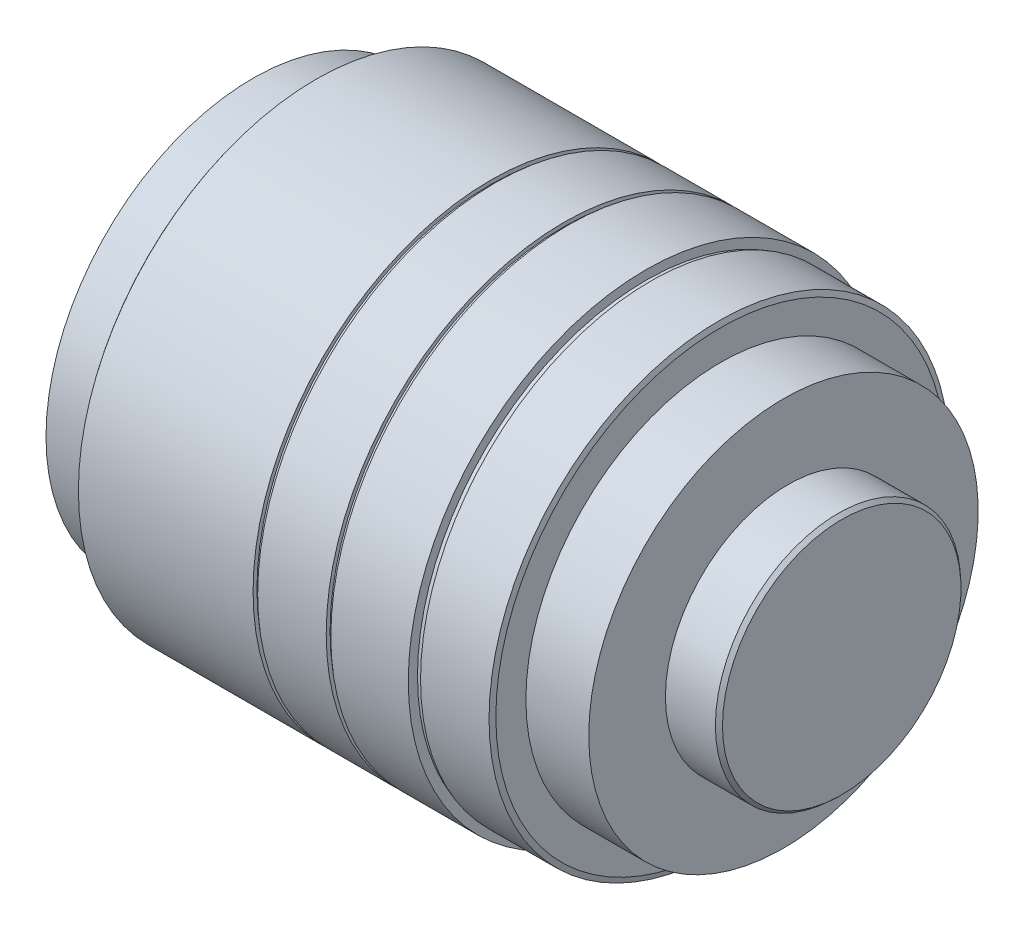
ISO-10303-21;
HEADER;
FILE_DESCRIPTION(('STEP AP214'),'2;1');
FILE_NAME('part.step','',(''),(''),'','','');
FILE_SCHEMA(('AUTOMOTIVE_DESIGN { 1 0 10303 214 1 1 1 1 }'));
ENDSEC;
DATA;
#1=APPLICATION_CONTEXT('core data for automotive mechanical design processes');
#2=APPLICATION_PROTOCOL_DEFINITION('international standard','automotive_design',2000,#1);
#3=PRODUCT_CONTEXT('',#1,'mechanical');
#4=PRODUCT('Part','Part','',(#3));
#5=PRODUCT_RELATED_PRODUCT_CATEGORY('part','',(#4));
#6=PRODUCT_DEFINITION_FORMATION('','',#4);
#7=PRODUCT_DEFINITION_CONTEXT('part definition',#1,'design');
#8=PRODUCT_DEFINITION('design','',#6,#7);
#9=PRODUCT_DEFINITION_SHAPE('','',#8);
#10=(LENGTH_UNIT() NAMED_UNIT(*) SI_UNIT(.MILLI.,.METRE.));
#11=(NAMED_UNIT(*) PLANE_ANGLE_UNIT() SI_UNIT($,.RADIAN.));
#12=(NAMED_UNIT(*) SI_UNIT($,.STERADIAN.) SOLID_ANGLE_UNIT());
#13=UNCERTAINTY_MEASURE_WITH_UNIT(LENGTH_MEASURE(1.E-05),#10,'distance_accuracy_value','');
#14=(GEOMETRIC_REPRESENTATION_CONTEXT(3) GLOBAL_UNCERTAINTY_ASSIGNED_CONTEXT((#13)) GLOBAL_UNIT_ASSIGNED_CONTEXT((#10,
#11,#12)) REPRESENTATION_CONTEXT('',''));
#15=CARTESIAN_POINT('',(0.,0.,0.));
#16=DIRECTION('',(0.,0.,1.));
#17=DIRECTION('',(1.,0.,0.));
#18=AXIS2_PLACEMENT_3D('',#15,#16,#17);
#19=CARTESIAN_POINT('',(-38.4,0.,0.));
#20=DIRECTION('',(1.,0.,0.));
#21=DIRECTION('',(0.,0.,-1.));
#22=AXIS2_PLACEMENT_3D('',#19,#20,#21);
#23=PLANE('',#22);
#24=CARTESIAN_POINT('',(-38.4,0.,0.));
#25=DIRECTION('',(-1.,0.,0.));
#26=DIRECTION('',(0.,0.,1.));
#27=AXIS2_PLACEMENT_3D('',#24,#25,#26);
#28=CIRCLE('',#27,9.11286089238845);
#29=CARTESIAN_POINT('',(-38.4,0.,9.11286089238845));
#30=VERTEX_POINT('',#29);
#31=EDGE_CURVE('E71',#30,#30,#28,.T.);
#32=ORIENTED_EDGE('',*,*,#31,.F.);
#33=EDGE_LOOP('',(#32));
#34=FACE_BOUND('',#33,.T.);
#35=CARTESIAN_POINT('',(-38.4,0.,0.));
#36=DIRECTION('',(-1.,0.,0.));
#37=DIRECTION('',(0.,0.,1.));
#38=AXIS2_PLACEMENT_3D('',#35,#36,#37);
#39=CIRCLE('',#38,13.5);
#40=CARTESIAN_POINT('',(-38.4,0.,13.5));
#41=VERTEX_POINT('',#40);
#42=EDGE_CURVE('E11',#41,#41,#39,.T.);
#43=ORIENTED_EDGE('',*,*,#42,.T.);
#44=EDGE_LOOP('',(#43));
#45=FACE_BOUND('',#44,.T.);
#46=ADVANCED_FACE('F40',(#34,#45),#23,.F.);
#47=CARTESIAN_POINT('',(-61.5958718073628,0.,0.));
#48=DIRECTION('',(-1.,0.,0.));
#49=DIRECTION('',(0.,0.,1.));
#50=AXIS2_PLACEMENT_3D('',#47,#48,#49);
#51=CYLINDRICAL_SURFACE('',#50,13.5);
#52=ORIENTED_EDGE('',*,*,#42,.F.);
#53=EDGE_LOOP('',(#52));
#54=FACE_BOUND('',#53,.T.);
#55=CARTESIAN_POINT('',(-34.4,0.,0.));
#56=DIRECTION('',(-1.,0.,0.));
#57=DIRECTION('',(0.,0.,1.));
#58=AXIS2_PLACEMENT_3D('',#55,#56,#57);
#59=CIRCLE('',#58,13.5);
#60=CARTESIAN_POINT('',(-34.4,0.,13.5));
#61=VERTEX_POINT('',#60);
#62=EDGE_CURVE('E46',#61,#61,#59,.T.);
#63=ORIENTED_EDGE('',*,*,#62,.T.);
#64=EDGE_LOOP('',(#63));
#65=FACE_BOUND('',#64,.T.);
#66=ADVANCED_FACE('F62',(#54,#65),#51,.T.);
#67=CARTESIAN_POINT('',(-34.4,13.5,0.));
#68=DIRECTION('',(1.,0.,0.));
#69=DIRECTION('',(0.,0.,-1.));
#70=AXIS2_PLACEMENT_3D('',#67,#68,#69);
#71=PLANE('',#70);
#72=ORIENTED_EDGE('',*,*,#62,.F.);
#73=EDGE_LOOP('',(#72));
#74=FACE_BOUND('',#73,.T.);
#75=CARTESIAN_POINT('',(-34.4,0.,0.));
#76=DIRECTION('',(-1.,0.,0.));
#77=DIRECTION('',(0.,0.,1.));
#78=AXIS2_PLACEMENT_3D('',#75,#76,#77);
#79=CIRCLE('',#78,15.3545919618712);
#80=CARTESIAN_POINT('',(-34.4,0.,15.3545919618712));
#81=VERTEX_POINT('',#80);
#82=EDGE_CURVE('E77',#81,#81,#79,.T.);
#83=ORIENTED_EDGE('',*,*,#82,.T.);
#84=EDGE_LOOP('',(#83));
#85=FACE_BOUND('',#84,.T.);
#86=ADVANCED_FACE('F67',(#74,#85),#71,.F.);
#87=CARTESIAN_POINT('',(-34.2874689845351,0.,0.));
#88=DIRECTION('',(1.,0.,0.));
#89=DIRECTION('',(0.,0.,-1.));
#90=AXIS2_PLACEMENT_3D('',#87,#88,#89);
#91=CONICAL_SURFACE('',#90,15.5,0.912174996972071);
#92=ORIENTED_EDGE('',*,*,#82,.F.);
#93=EDGE_LOOP('',(#92));
#94=FACE_BOUND('',#93,.T.);
#95=CARTESIAN_POINT('',(-34.2874689845351,0.,0.));
#96=DIRECTION('',(-1.,0.,0.));
#97=DIRECTION('',(0.,0.,1.));
#98=AXIS2_PLACEMENT_3D('',#95,#96,#97);
#99=CIRCLE('',#98,15.5);
#100=CARTESIAN_POINT('',(-34.2874689845351,0.,15.5));
#101=VERTEX_POINT('',#100);
#102=EDGE_CURVE('E79',#101,#101,#99,.T.);
#103=ORIENTED_EDGE('',*,*,#102,.T.);
#104=EDGE_LOOP('',(#103));
#105=FACE_BOUND('',#104,.T.);
#106=ADVANCED_FACE('F235',(#94,#105),#91,.T.);
#107=CARTESIAN_POINT('',(-61.5958718073628,0.,0.));
#108=DIRECTION('',(-1.,0.,0.));
#109=DIRECTION('',(0.,0.,1.));
#110=AXIS2_PLACEMENT_3D('',#107,#108,#109);
#111=CYLINDRICAL_SURFACE('',#110,15.5);
#112=ORIENTED_EDGE('',*,*,#102,.F.);
#113=EDGE_LOOP('',(#112));
#114=FACE_BOUND('',#113,.T.);
#115=CARTESIAN_POINT('',(-22.895018975904,0.,0.));
#116=DIRECTION('',(-1.,0.,0.));
#117=DIRECTION('',(0.,0.,1.));
#118=AXIS2_PLACEMENT_3D('',#115,#116,#117);
#119=CIRCLE('',#118,15.5);
#120=CARTESIAN_POINT('',(-22.895018975904,0.,15.5));
#121=VERTEX_POINT('',#120);
#122=EDGE_CURVE('E84',#121,#121,#119,.T.);
#123=ORIENTED_EDGE('',*,*,#122,.T.);
#124=EDGE_LOOP('',(#123));
#125=FACE_BOUND('',#124,.T.);
#126=ADVANCED_FACE('F231',(#114,#125),#111,.T.);
#127=CARTESIAN_POINT('',(-22.895018975904,15.5,0.));
#128=DIRECTION('',(-1.,0.,0.));
#129=DIRECTION('',(0.,0.,1.));
#130=AXIS2_PLACEMENT_3D('',#127,#128,#129);
#131=PLANE('',#130);
#132=ORIENTED_EDGE('',*,*,#122,.F.);
#133=EDGE_LOOP('',(#132));
#134=FACE_BOUND('',#133,.T.);
#135=CARTESIAN_POINT('',(-22.895018975904,0.,0.));
#136=DIRECTION('',(-1.,0.,0.));
#137=DIRECTION('',(0.,0.,1.));
#138=AXIS2_PLACEMENT_3D('',#135,#136,#137);
#139=CIRCLE('',#138,15.2469207351439);
#140=CARTESIAN_POINT('',(-22.895018975904,0.,15.2469207351439));
#141=VERTEX_POINT('',#140);
#142=EDGE_CURVE('E87',#141,#141,#139,.T.);
#143=ORIENTED_EDGE('',*,*,#142,.T.);
#144=EDGE_LOOP('',(#143));
#145=FACE_BOUND('',#144,.T.);
#146=ADVANCED_FACE('F227',(#134,#145),#131,.F.);
#147=CARTESIAN_POINT('',(-61.5958718073628,0.,0.));
#148=DIRECTION('',(-1.,0.,0.));
#149=DIRECTION('',(0.,0.,1.));
#150=AXIS2_PLACEMENT_3D('',#147,#148,#149);
#151=CYLINDRICAL_SURFACE('',#150,15.2469207351439);
#152=ORIENTED_EDGE('',*,*,#142,.F.);
#153=EDGE_LOOP('',(#152));
#154=FACE_BOUND('',#153,.T.);
#155=CARTESIAN_POINT('',(-22.595018975904,0.,0.));
#156=DIRECTION('',(-1.,0.,0.));
#157=DIRECTION('',(0.,0.,1.));
#158=AXIS2_PLACEMENT_3D('',#155,#156,#157);
#159=CIRCLE('',#158,15.2469207351439);
#160=CARTESIAN_POINT('',(-22.595018975904,0.,15.2469207351439));
#161=VERTEX_POINT('',#160);
#162=EDGE_CURVE('E90',#161,#161,#159,.T.);
#163=ORIENTED_EDGE('',*,*,#162,.T.);
#164=EDGE_LOOP('',(#163));
#165=FACE_BOUND('',#164,.T.);
#166=ADVANCED_FACE('F223',(#154,#165),#151,.T.);
#167=CARTESIAN_POINT('',(-22.595018975904,15.2469207351439,0.));
#168=DIRECTION('',(1.,0.,0.));
#169=DIRECTION('',(0.,0.,-1.));
#170=AXIS2_PLACEMENT_3D('',#167,#168,#169);
#171=PLANE('',#170);
#172=ORIENTED_EDGE('',*,*,#162,.F.);
#173=EDGE_LOOP('',(#172));
#174=FACE_BOUND('',#173,.T.);
#175=CARTESIAN_POINT('',(-22.595018975904,0.,0.));
#176=DIRECTION('',(-1.,0.,0.));
#177=DIRECTION('',(0.,0.,1.));
#178=AXIS2_PLACEMENT_3D('',#175,#176,#177);
#179=CIRCLE('',#178,15.5);
#180=CARTESIAN_POINT('',(-22.595018975904,0.,15.5));
#181=VERTEX_POINT('',#180);
#182=EDGE_CURVE('E93',#181,#181,#179,.T.);
#183=ORIENTED_EDGE('',*,*,#182,.T.);
#184=EDGE_LOOP('',(#183));
#185=FACE_BOUND('',#184,.T.);
#186=ADVANCED_FACE('F219',(#174,#185),#171,.F.);
#187=CARTESIAN_POINT('',(-61.5958718073628,0.,0.));
#188=DIRECTION('',(-1.,0.,0.));
#189=DIRECTION('',(0.,0.,1.));
#190=AXIS2_PLACEMENT_3D('',#187,#188,#189);
#191=CYLINDRICAL_SURFACE('',#190,15.5);
#192=ORIENTED_EDGE('',*,*,#182,.F.);
#193=EDGE_LOOP('',(#192));
#194=FACE_BOUND('',#193,.T.);
#195=CARTESIAN_POINT('',(-18.1236407657199,0.,0.));
#196=DIRECTION('',(-1.,0.,0.));
#197=DIRECTION('',(0.,0.,1.));
#198=AXIS2_PLACEMENT_3D('',#195,#196,#197);
#199=CIRCLE('',#198,15.5);
#200=CARTESIAN_POINT('',(-18.1236407657199,0.,15.5));
#201=VERTEX_POINT('',#200);
#202=EDGE_CURVE('E96',#201,#201,#199,.T.);
#203=ORIENTED_EDGE('',*,*,#202,.T.);
#204=EDGE_LOOP('',(#203));
#205=FACE_BOUND('',#204,.T.);
#206=ADVANCED_FACE('F215',(#194,#205),#191,.T.);
#207=CARTESIAN_POINT('',(-18.1236407657199,15.5,0.));
#208=DIRECTION('',(-1.,0.,0.));
#209=DIRECTION('',(0.,0.,1.));
#210=AXIS2_PLACEMENT_3D('',#207,#208,#209);
#211=PLANE('',#210);
#212=ORIENTED_EDGE('',*,*,#202,.F.);
#213=EDGE_LOOP('',(#212));
#214=FACE_BOUND('',#213,.T.);
#215=CARTESIAN_POINT('',(-18.1236407657199,0.,0.));
#216=DIRECTION('',(-1.,0.,0.));
#217=DIRECTION('',(0.,0.,1.));
#218=AXIS2_PLACEMENT_3D('',#215,#216,#217);
#219=CIRCLE('',#218,15.2469207351439);
#220=CARTESIAN_POINT('',(-18.1236407657199,0.,15.2469207351439));
#221=VERTEX_POINT('',#220);
#222=EDGE_CURVE('E99',#221,#221,#219,.T.);
#223=ORIENTED_EDGE('',*,*,#222,.T.);
#224=EDGE_LOOP('',(#223));
#225=FACE_BOUND('',#224,.T.);
#226=ADVANCED_FACE('F211',(#214,#225),#211,.F.);
#227=CARTESIAN_POINT('',(-61.5958718073628,0.,0.));
#228=DIRECTION('',(-1.,0.,0.));
#229=DIRECTION('',(0.,0.,1.));
#230=AXIS2_PLACEMENT_3D('',#227,#228,#229);
#231=CYLINDRICAL_SURFACE('',#230,15.2469207351439);
#232=ORIENTED_EDGE('',*,*,#222,.F.);
#233=EDGE_LOOP('',(#232));
#234=FACE_BOUND('',#233,.T.);
#235=CARTESIAN_POINT('',(-17.8236407657199,0.,0.));
#236=DIRECTION('',(-1.,0.,0.));
#237=DIRECTION('',(0.,0.,1.));
#238=AXIS2_PLACEMENT_3D('',#235,#236,#237);
#239=CIRCLE('',#238,15.2469207351439);
#240=CARTESIAN_POINT('',(-17.8236407657199,0.,15.2469207351439));
#241=VERTEX_POINT('',#240);
#242=EDGE_CURVE('E102',#241,#241,#239,.T.);
#243=ORIENTED_EDGE('',*,*,#242,.T.);
#244=EDGE_LOOP('',(#243));
#245=FACE_BOUND('',#244,.T.);
#246=ADVANCED_FACE('F207',(#234,#245),#231,.T.);
#247=CARTESIAN_POINT('',(-17.8236407657199,15.2469207351439,0.));
#248=DIRECTION('',(1.,0.,0.));
#249=DIRECTION('',(0.,0.,-1.));
#250=AXIS2_PLACEMENT_3D('',#247,#248,#249);
#251=PLANE('',#250);
#252=ORIENTED_EDGE('',*,*,#242,.F.);
#253=EDGE_LOOP('',(#252));
#254=FACE_BOUND('',#253,.T.);
#255=CARTESIAN_POINT('',(-17.8236407657199,0.,0.));
#256=DIRECTION('',(-1.,0.,0.));
#257=DIRECTION('',(0.,0.,1.));
#258=AXIS2_PLACEMENT_3D('',#255,#256,#257);
#259=CIRCLE('',#258,15.5);
#260=CARTESIAN_POINT('',(-17.8236407657199,0.,15.5));
#261=VERTEX_POINT('',#260);
#262=EDGE_CURVE('E105',#261,#261,#259,.T.);
#263=ORIENTED_EDGE('',*,*,#262,.T.);
#264=EDGE_LOOP('',(#263));
#265=FACE_BOUND('',#264,.T.);
#266=ADVANCED_FACE('F203',(#254,#265),#251,.F.);
#267=CARTESIAN_POINT('',(-61.5958718073628,0.,0.));
#268=DIRECTION('',(-1.,0.,0.));
#269=DIRECTION('',(0.,0.,1.));
#270=AXIS2_PLACEMENT_3D('',#267,#268,#269);
#271=CYLINDRICAL_SURFACE('',#270,15.5);
#272=ORIENTED_EDGE('',*,*,#262,.F.);
#273=EDGE_LOOP('',(#272));
#274=FACE_BOUND('',#273,.T.);
#275=CARTESIAN_POINT('',(-12.7714587608146,0.,0.));
#276=DIRECTION('',(-1.,0.,0.));
#277=DIRECTION('',(0.,0.,1.));
#278=AXIS2_PLACEMENT_3D('',#275,#276,#277);
#279=CIRCLE('',#278,15.5);
#280=CARTESIAN_POINT('',(-12.7714587608146,0.,15.5));
#281=VERTEX_POINT('',#280);
#282=EDGE_CURVE('E108',#281,#281,#279,.T.);
#283=ORIENTED_EDGE('',*,*,#282,.T.);
#284=EDGE_LOOP('',(#283));
#285=FACE_BOUND('',#284,.T.);
#286=ADVANCED_FACE('F199',(#274,#285),#271,.T.);
#287=CARTESIAN_POINT('',(-12.7714587608146,15.5,0.));
#288=DIRECTION('',(-1.,0.,0.));
#289=DIRECTION('',(0.,0.,1.));
#290=AXIS2_PLACEMENT_3D('',#287,#288,#289);
#291=PLANE('',#290);
#292=ORIENTED_EDGE('',*,*,#282,.F.);
#293=EDGE_LOOP('',(#292));
#294=FACE_BOUND('',#293,.T.);
#295=CARTESIAN_POINT('',(-12.7714587608146,0.,0.));
#296=DIRECTION('',(-1.,0.,0.));
#297=DIRECTION('',(0.,0.,1.));
#298=AXIS2_PLACEMENT_3D('',#295,#296,#297);
#299=CIRCLE('',#298,14.8997702879257);
#300=CARTESIAN_POINT('',(-12.7714587608146,0.,14.8997702879257));
#301=VERTEX_POINT('',#300);
#302=EDGE_CURVE('E111',#301,#301,#299,.T.);
#303=ORIENTED_EDGE('',*,*,#302,.T.);
#304=EDGE_LOOP('',(#303));
#305=FACE_BOUND('',#304,.T.);
#306=ADVANCED_FACE('F195',(#294,#305),#291,.F.);
#307=CARTESIAN_POINT('',(-61.5958718073628,0.,0.));
#308=DIRECTION('',(-1.,0.,0.));
#309=DIRECTION('',(0.,0.,1.));
#310=AXIS2_PLACEMENT_3D('',#307,#308,#309);
#311=CYLINDRICAL_SURFACE('',#310,14.8997702879257);
#312=ORIENTED_EDGE('',*,*,#302,.F.);
#313=EDGE_LOOP('',(#312));
#314=FACE_BOUND('',#313,.T.);
#315=CARTESIAN_POINT('',(-12.4714587608146,0.,0.));
#316=DIRECTION('',(-1.,0.,0.));
#317=DIRECTION('',(0.,0.,1.));
#318=AXIS2_PLACEMENT_3D('',#315,#316,#317);
#319=CIRCLE('',#318,14.8997702879257);
#320=CARTESIAN_POINT('',(-12.4714587608146,0.,14.8997702879257));
#321=VERTEX_POINT('',#320);
#322=EDGE_CURVE('E114',#321,#321,#319,.T.);
#323=ORIENTED_EDGE('',*,*,#322,.T.);
#324=EDGE_LOOP('',(#323));
#325=FACE_BOUND('',#324,.T.);
#326=ADVANCED_FACE('F191',(#314,#325),#311,.T.);
#327=CARTESIAN_POINT('',(-12.4714587608146,14.8997702879257,0.));
#328=DIRECTION('',(1.,0.,0.));
#329=DIRECTION('',(0.,0.,-1.));
#330=AXIS2_PLACEMENT_3D('',#327,#328,#329);
#331=PLANE('',#330);
#332=ORIENTED_EDGE('',*,*,#322,.F.);
#333=EDGE_LOOP('',(#332));
#334=FACE_BOUND('',#333,.T.);
#335=CARTESIAN_POINT('',(-12.4714587608146,0.,0.));
#336=DIRECTION('',(-1.,0.,0.));
#337=DIRECTION('',(0.,0.,1.));
#338=AXIS2_PLACEMENT_3D('',#335,#336,#337);
#339=CIRCLE('',#338,15.);
#340=CARTESIAN_POINT('',(-12.4714587608146,0.,15.));
#341=VERTEX_POINT('',#340);
#342=EDGE_CURVE('E117',#341,#341,#339,.T.);
#343=ORIENTED_EDGE('',*,*,#342,.T.);
#344=EDGE_LOOP('',(#343));
#345=FACE_BOUND('',#344,.T.);
#346=ADVANCED_FACE('F187',(#334,#345),#331,.F.);
#347=CARTESIAN_POINT('',(-61.5958718073628,0.,0.));
#348=DIRECTION('',(-1.,0.,0.));
#349=DIRECTION('',(0.,0.,1.));
#350=AXIS2_PLACEMENT_3D('',#347,#348,#349);
#351=CYLINDRICAL_SURFACE('',#350,15.);
#352=ORIENTED_EDGE('',*,*,#342,.F.);
#353=EDGE_LOOP('',(#352));
#354=FACE_BOUND('',#353,.T.);
#355=CARTESIAN_POINT('',(-8.00410700313164,0.,0.));
#356=DIRECTION('',(-1.,0.,0.));
#357=DIRECTION('',(0.,0.,1.));
#358=AXIS2_PLACEMENT_3D('',#355,#356,#357);
#359=CIRCLE('',#358,15.);
#360=CARTESIAN_POINT('',(-8.00410700313164,0.,15.));
#361=VERTEX_POINT('',#360);
#362=EDGE_CURVE('E120',#361,#361,#359,.T.);
#363=ORIENTED_EDGE('',*,*,#362,.T.);
#364=EDGE_LOOP('',(#363));
#365=FACE_BOUND('',#364,.T.);
#366=ADVANCED_FACE('F183',(#354,#365),#351,.T.);
#367=CARTESIAN_POINT('',(-7.9,0.,0.));
#368=DIRECTION('',(-1.,0.,0.));
#369=DIRECTION('',(0.,0.,1.));
#370=AXIS2_PLACEMENT_3D('',#367,#368,#369);
#371=CONICAL_SURFACE('',#370,14.6603014205415,1.27341550471687);
#372=ORIENTED_EDGE('',*,*,#362,.F.);
#373=EDGE_LOOP('',(#372));
#374=FACE_BOUND('',#373,.T.);
#375=CARTESIAN_POINT('',(-7.9,0.,0.));
#376=DIRECTION('',(-1.,0.,0.));
#377=DIRECTION('',(0.,0.,1.));
#378=AXIS2_PLACEMENT_3D('',#375,#376,#377);
#379=CIRCLE('',#378,14.6603014205415);
#380=CARTESIAN_POINT('',(-7.9,0.,14.6603014205415));
#381=VERTEX_POINT('',#380);
#382=EDGE_CURVE('E123',#381,#381,#379,.T.);
#383=ORIENTED_EDGE('',*,*,#382,.T.);
#384=EDGE_LOOP('',(#383));
#385=FACE_BOUND('',#384,.T.);
#386=ADVANCED_FACE('F179',(#374,#385),#371,.T.);
#387=CARTESIAN_POINT('',(-7.9,14.6603014205415,0.));
#388=DIRECTION('',(-1.,0.,0.));
#389=DIRECTION('',(0.,0.,1.));
#390=AXIS2_PLACEMENT_3D('',#387,#388,#389);
#391=PLANE('',#390);
#392=ORIENTED_EDGE('',*,*,#382,.F.);
#393=EDGE_LOOP('',(#392));
#394=FACE_BOUND('',#393,.T.);
#395=CARTESIAN_POINT('',(-7.9,0.,0.));
#396=DIRECTION('',(-1.,0.,0.));
#397=DIRECTION('',(0.,0.,1.));
#398=AXIS2_PLACEMENT_3D('',#395,#396,#397);
#399=CIRCLE('',#398,12.7);
#400=CARTESIAN_POINT('',(-7.9,0.,12.7));
#401=VERTEX_POINT('',#400);
#402=EDGE_CURVE('E126',#401,#401,#399,.T.);
#403=ORIENTED_EDGE('',*,*,#402,.T.);
#404=EDGE_LOOP('',(#403));
#405=FACE_BOUND('',#404,.T.);
#406=ADVANCED_FACE('F175',(#394,#405),#391,.F.);
#407=CARTESIAN_POINT('',(-61.5958718073628,0.,0.));
#408=DIRECTION('',(-1.,0.,0.));
#409=DIRECTION('',(0.,0.,1.));
#410=AXIS2_PLACEMENT_3D('',#407,#408,#409);
#411=CYLINDRICAL_SURFACE('',#410,12.7);
#412=ORIENTED_EDGE('',*,*,#402,.F.);
#413=EDGE_LOOP('',(#412));
#414=FACE_BOUND('',#413,.T.);
#415=CARTESIAN_POINT('',(-3.79983792512216,0.,0.));
#416=DIRECTION('',(-1.,0.,0.));
#417=DIRECTION('',(0.,0.,1.));
#418=AXIS2_PLACEMENT_3D('',#415,#416,#417);
#419=CIRCLE('',#418,12.7);
#420=CARTESIAN_POINT('',(-3.79983792512216,0.,12.7));
#421=VERTEX_POINT('',#420);
#422=EDGE_CURVE('E129',#421,#421,#419,.T.);
#423=ORIENTED_EDGE('',*,*,#422,.T.);
#424=EDGE_LOOP('',(#423));
#425=FACE_BOUND('',#424,.T.);
#426=ADVANCED_FACE('F171',(#414,#425),#411,.T.);
#427=CARTESIAN_POINT('',(-3.79983792512216,12.7,0.));
#428=DIRECTION('',(-1.,0.,0.));
#429=DIRECTION('',(0.,0.,1.));
#430=AXIS2_PLACEMENT_3D('',#427,#428,#429);
#431=PLANE('',#430);
#432=ORIENTED_EDGE('',*,*,#422,.F.);
#433=EDGE_LOOP('',(#432));
#434=FACE_BOUND('',#433,.T.);
#435=CARTESIAN_POINT('',(-3.79983792512216,0.,0.));
#436=DIRECTION('',(-1.,0.,0.));
#437=DIRECTION('',(0.,0.,1.));
#438=AXIS2_PLACEMENT_3D('',#435,#436,#437);
#439=CIRCLE('',#438,7.51509640467999);
#440=CARTESIAN_POINT('',(-3.79983792512216,0.,7.51509640467999));
#441=VERTEX_POINT('',#440);
#442=EDGE_CURVE('E132',#441,#441,#439,.T.);
#443=ORIENTED_EDGE('',*,*,#442,.T.);
#444=EDGE_LOOP('',(#443));
#445=FACE_BOUND('',#444,.T.);
#446=ADVANCED_FACE('F167',(#434,#445),#431,.F.);
#447=CARTESIAN_POINT('',(-61.5958718073628,0.,0.));
#448=DIRECTION('',(-1.,0.,0.));
#449=DIRECTION('',(0.,0.,1.));
#450=AXIS2_PLACEMENT_3D('',#447,#448,#449);
#451=CYLINDRICAL_SURFACE('',#450,7.51509640467999);
#452=ORIENTED_EDGE('',*,*,#442,.F.);
#453=EDGE_LOOP('',(#452));
#454=FACE_BOUND('',#453,.T.);
#455=CARTESIAN_POINT('',(-3.49983792512216,0.,0.));
#456=DIRECTION('',(-1.,0.,0.));
#457=DIRECTION('',(0.,0.,1.));
#458=AXIS2_PLACEMENT_3D('',#455,#456,#457);
#459=CIRCLE('',#458,7.51509640467999);
#460=CARTESIAN_POINT('',(-3.49983792512216,0.,7.51509640467999));
#461=VERTEX_POINT('',#460);
#462=EDGE_CURVE('E135',#461,#461,#459,.T.);
#463=ORIENTED_EDGE('',*,*,#462,.T.);
#464=EDGE_LOOP('',(#463));
#465=FACE_BOUND('',#464,.T.);
#466=ADVANCED_FACE('F163',(#454,#465),#451,.T.);
#467=CARTESIAN_POINT('',(-3.49983792512216,7.51509640467999,0.));
#468=DIRECTION('',(1.,0.,0.));
#469=DIRECTION('',(0.,0.,-1.));
#470=AXIS2_PLACEMENT_3D('',#467,#468,#469);
#471=PLANE('',#470);
#472=ORIENTED_EDGE('',*,*,#462,.F.);
#473=EDGE_LOOP('',(#472));
#474=FACE_BOUND('',#473,.T.);
#475=CARTESIAN_POINT('',(-3.49983792512216,0.,0.));
#476=DIRECTION('',(-1.,0.,0.));
#477=DIRECTION('',(0.,0.,1.));
#478=AXIS2_PLACEMENT_3D('',#475,#476,#477);
#479=CIRCLE('',#478,8.);
#480=CARTESIAN_POINT('',(-3.49983792512216,0.,8.));
#481=VERTEX_POINT('',#480);
#482=EDGE_CURVE('E138',#481,#481,#479,.T.);
#483=ORIENTED_EDGE('',*,*,#482,.T.);
#484=EDGE_LOOP('',(#483));
#485=FACE_BOUND('',#484,.T.);
#486=ADVANCED_FACE('F156',(#474,#485),#471,.F.);
#487=CARTESIAN_POINT('',(-61.5958718073628,0.,0.));
#488=DIRECTION('',(-1.,0.,0.));
#489=DIRECTION('',(0.,0.,1.));
#490=AXIS2_PLACEMENT_3D('',#487,#488,#489);
#491=CYLINDRICAL_SURFACE('',#490,8.);
#492=ORIENTED_EDGE('',*,*,#482,.F.);
#493=EDGE_LOOP('',(#492));
#494=FACE_BOUND('',#493,.T.);
#495=CARTESIAN_POINT('',(-0.240891884367968,0.,0.));
#496=DIRECTION('',(-1.,0.,0.));
#497=DIRECTION('',(0.,0.,1.));
#498=AXIS2_PLACEMENT_3D('',#495,#496,#497);
#499=CIRCLE('',#498,8.);
#500=CARTESIAN_POINT('',(-0.240891884367968,0.,8.));
#501=VERTEX_POINT('',#500);
#502=EDGE_CURVE('E141',#501,#501,#499,.T.);
#503=ORIENTED_EDGE('',*,*,#502,.T.);
#504=EDGE_LOOP('',(#503));
#505=FACE_BOUND('',#504,.T.);
#506=ADVANCED_FACE('F150',(#494,#505),#491,.T.);
#507=CARTESIAN_POINT('',(0.,0.,0.));
#508=DIRECTION('',(-1.,0.,0.));
#509=DIRECTION('',(0.,0.,1.));
#510=AXIS2_PLACEMENT_3D('',#507,#508,#509);
#511=CONICAL_SURFACE('',#510,7.77750436886888,0.745719498615744);
#512=ORIENTED_EDGE('',*,*,#502,.F.);
#513=EDGE_LOOP('',(#512));
#514=FACE_BOUND('',#513,.T.);
#515=CARTESIAN_POINT('',(0.,0.,0.));
#516=DIRECTION('',(-1.,0.,0.));
#517=DIRECTION('',(0.,0.,1.));
#518=AXIS2_PLACEMENT_3D('',#515,#516,#517);
#519=CIRCLE('',#518,7.77750436886888);
#520=CARTESIAN_POINT('',(0.,0.,7.77750436886888));
#521=VERTEX_POINT('',#520);
#522=EDGE_CURVE('E144',#521,#521,#519,.T.);
#523=ORIENTED_EDGE('',*,*,#522,.T.);
#524=EDGE_LOOP('',(#523));
#525=FACE_BOUND('',#524,.T.);
#526=ADVANCED_FACE('F57',(#514,#525),#511,.T.);
#527=CARTESIAN_POINT('',(0.,7.77750436886888,0.));
#528=DIRECTION('',(-1.,0.,0.));
#529=DIRECTION('',(0.,0.,1.));
#530=AXIS2_PLACEMENT_3D('',#527,#528,#529);
#531=PLANE('',#530);
#532=ORIENTED_EDGE('',*,*,#522,.F.);
#533=EDGE_LOOP('',(#532));
#534=FACE_BOUND('',#533,.T.);
#535=ADVANCED_FACE('F51',(#534),#531,.F.);
#536=CARTESIAN_POINT('',(-23.0366259374413,0.,0.560149310843977));
#537=DIRECTION('',(0.,-1.,0.));
#538=DIRECTION('',(0.,0.,1.));
#539=AXIS2_PLACEMENT_3D('',#536,#537,#538);
#540=CIRCLE('',#539,17.5835758019575);
#541=TRIMMED_CURVE('',#540,(PARAMETER_VALUE(-1.60265811094789)),
(PARAMETER_VALUE(1.60265811094789)),.T.,.PARAMETER.);
#542=CARTESIAN_POINT('',(-23.0366259374413,0.,0.));
#543=DIRECTION('',(-1.,0.,0.));
#544=AXIS1_PLACEMENT('',#542,#543);
#545=SURFACE_OF_REVOLUTION('',#541,#544);
#546=ORIENTED_EDGE('',*,*,#31,.T.);
#547=EDGE_LOOP('',(#546));
#548=FACE_BOUND('',#547,.T.);
#549=CARTESIAN_POINT('',(-40.6112773061811,0.,0.));
#550=VERTEX_POINT('',#549);
#551=VERTEX_LOOP('',#550);
#552=FACE_BOUND('',#551,.T.);
#553=ADVANCED_FACE('F49',(#548,#552),#545,.T.);
#554=CLOSED_SHELL('',(#46,#66,#86,#106,#126,#146,#166,#186,#206,#226,#246,#266,#286,#306,#326,
#346,#366,#386,#406,#426,#446,#466,#486,#506,#526,#535,#553));
#555=MANIFOLD_SOLID_BREP('B2',#554);
#556=ADVANCED_BREP_SHAPE_REPRESENTATION('',(#18,#555),#14);
#557=SHAPE_DEFINITION_REPRESENTATION(#9,#556);
ENDSEC;
END-ISO-10303-21;
